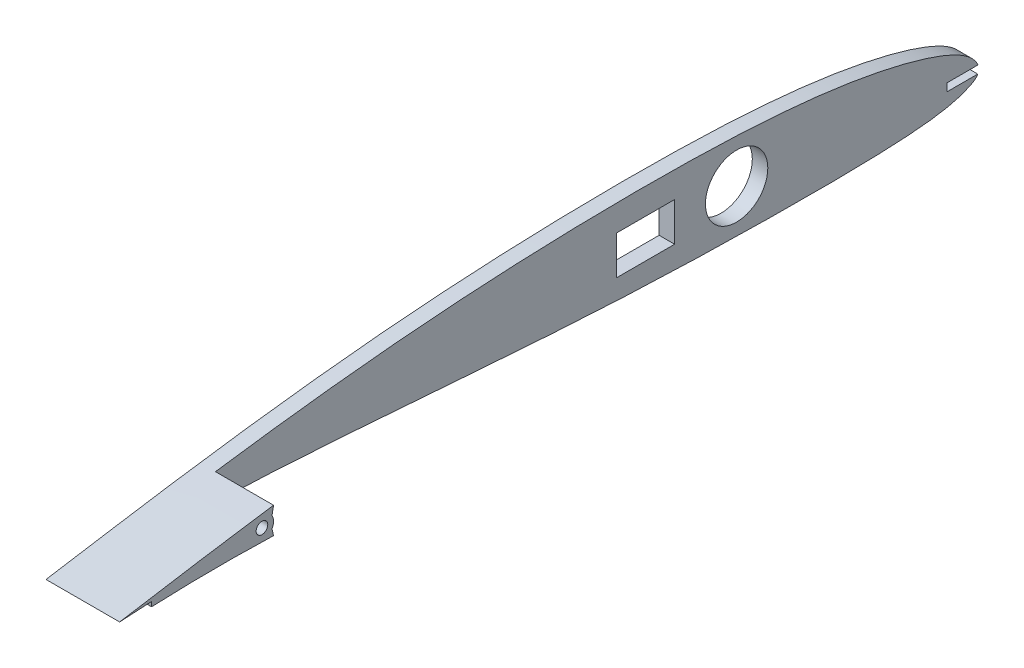
ISO-10303-21;
HEADER;
FILE_DESCRIPTION(('STEP AP214'),'2;1');
FILE_NAME('part.step','',(''),(''),'','','');
FILE_SCHEMA(('AUTOMOTIVE_DESIGN { 1 0 10303 214 1 1 1 1 }'));
ENDSEC;
DATA;
#1=APPLICATION_CONTEXT('core data for automotive mechanical design processes');
#2=APPLICATION_PROTOCOL_DEFINITION('international standard','automotive_design',2000,#1);
#3=PRODUCT_CONTEXT('',#1,'mechanical');
#4=PRODUCT('Part','Part','',(#3));
#5=PRODUCT_RELATED_PRODUCT_CATEGORY('part','',(#4));
#6=PRODUCT_DEFINITION_FORMATION('','',#4);
#7=PRODUCT_DEFINITION_CONTEXT('part definition',#1,'design');
#8=PRODUCT_DEFINITION('design','',#6,#7);
#9=PRODUCT_DEFINITION_SHAPE('','',#8);
#10=(LENGTH_UNIT() NAMED_UNIT(*) SI_UNIT(.MILLI.,.METRE.));
#11=(NAMED_UNIT(*) PLANE_ANGLE_UNIT() SI_UNIT($,.RADIAN.));
#12=(NAMED_UNIT(*) SI_UNIT($,.STERADIAN.) SOLID_ANGLE_UNIT());
#13=UNCERTAINTY_MEASURE_WITH_UNIT(LENGTH_MEASURE(1.E-05),#10,'distance_accuracy_value','');
#14=(GEOMETRIC_REPRESENTATION_CONTEXT(3) GLOBAL_UNCERTAINTY_ASSIGNED_CONTEXT((#13)) GLOBAL_UNIT_ASSIGNED_CONTEXT((#10,
#11,#12)) REPRESENTATION_CONTEXT('',''));
#15=CARTESIAN_POINT('',(0.,0.,0.));
#16=DIRECTION('',(0.,0.,1.));
#17=DIRECTION('',(1.,0.,0.));
#18=AXIS2_PLACEMENT_3D('',#15,#16,#17);
#19=CARTESIAN_POINT('',(4.,0.,250.));
#20=CARTESIAN_POINT('',(4.,-0.0080427959719715,250.000228293678));
#21=CARTESIAN_POINT('',(4.,0.172375657967406,248.284955515532));
#22=CARTESIAN_POINT('',(4.,0.308690014795419,246.518112419387));
#23=CARTESIAN_POINT('',(4.,0.685693593852336,242.189387343398));
#24=CARTESIAN_POINT('',(4.,1.07410152891603,236.806461263496));
#25=CARTESIAN_POINT('',(4.,1.49731723995003,229.680385951639));
#26=CARTESIAN_POINT('',(4.,1.8232186026768,221.18415869828));
#27=CARTESIAN_POINT('',(4.,1.96762610068065,211.337618207726));
#28=CARTESIAN_POINT('',(4.,1.83322105638369,200.371188527109));
#29=CARTESIAN_POINT('',(4.,1.38960528984164,188.499913622482));
#30=CARTESIAN_POINT('',(4.,0.706014078000893,175.953687417433));
#31=CARTESIAN_POINT('',(4.,-0.160208641561513,162.931424917666));
#32=CARTESIAN_POINT('',(4.,-1.14801632724376,149.615771743617));
#33=CARTESIAN_POINT('',(4.,-2.19092490983926,136.176354994724));
#34=CARTESIAN_POINT('',(4.,-3.21958397917046,122.767140548026));
#35=CARTESIAN_POINT('',(4.,-4.15274312671142,109.520053587455));
#36=CARTESIAN_POINT('',(4.,-4.93856436487493,96.5460959745437));
#37=CARTESIAN_POINT('',(4.,-5.53683070268675,83.9408193016427));
#38=CARTESIAN_POINT('',(4.,-5.94764820461108,71.8018392906514));
#39=CARTESIAN_POINT('',(4.,-6.21845093878312,60.2452560030716));
#40=CARTESIAN_POINT('',(4.,-6.35536975583973,49.3987328907547));
#41=CARTESIAN_POINT('',(4.,-6.38138796281789,39.3972261942655));
#42=CARTESIAN_POINT('',(4.,-6.26504923032313,30.3619348419668));
#43=CARTESIAN_POINT('',(4.,-6.01216491688521,22.4121811031587));
#44=CARTESIAN_POINT('',(4.,-5.59743390072595,15.6262272306516));
#45=CARTESIAN_POINT('',(4.,-4.92870657935606,10.0719075109048));
#46=CARTESIAN_POINT('',(4.,-4.04044698146404,5.69769261214423));
#47=CARTESIAN_POINT('',(4.,-2.8657529844069,2.62532063874475));
#48=CARTESIAN_POINT('',(4.,-1.7115284699546,0.494884225045661));
#49=CARTESIAN_POINT('',(4.,-0.410454230626488,-0.0213125491030087));
#50=CARTESIAN_POINT('',(4.,0.792659826704065,0.0311691995850224));
#51=CARTESIAN_POINT('',(4.,2.30568433693192,0.812599241892923));
#52=CARTESIAN_POINT('',(4.,4.23835242447377,2.72886351673443));
#53=CARTESIAN_POINT('',(4.,6.11817212106947,5.76990724125498));
#54=CARTESIAN_POINT('',(4.,7.91359420170391,9.88094280419771));
#55=CARTESIAN_POINT('',(4.,9.64131817838287,15.0749304677094));
#56=CARTESIAN_POINT('',(4.,11.2838964878058,21.2987522216172));
#57=CARTESIAN_POINT('',(4.,12.7883817585812,28.4971721202648));
#58=CARTESIAN_POINT('',(4.,14.0978349081275,36.6073734062479));
#59=CARTESIAN_POINT('',(4.,15.1594290171638,45.573028440303));
#60=CARTESIAN_POINT('',(4.,15.9609039979753,55.3329100744701));
#61=CARTESIAN_POINT('',(4.,16.4940697383882,65.8165364983871));
#62=CARTESIAN_POINT('',(4.,16.7919897051422,76.9313762604552));
#63=CARTESIAN_POINT('',(4.,16.864754130909,88.5669490281142));
#64=CARTESIAN_POINT('',(4.,16.7267152914356,100.596999885542));
#65=CARTESIAN_POINT('',(4.,16.3833850637257,112.888825982424));
#66=CARTESIAN_POINT('',(4.,15.825573666627,125.31161581915));
#67=CARTESIAN_POINT('',(4.,15.0523318700684,137.743791097076));
#68=CARTESIAN_POINT('',(4.,14.0593390742259,150.072384382085));
#69=CARTESIAN_POINT('',(4.,12.8815869860292,162.191375055682));
#70=CARTESIAN_POINT('',(4.,11.5492803460744,173.989074322246));
#71=CARTESIAN_POINT('',(4.,10.1162497290333,185.35236444642));
#72=CARTESIAN_POINT('',(4.,8.63237912523508,196.163081697706));
#73=CARTESIAN_POINT('',(4.,7.13151388385034,206.300441402258));
#74=CARTESIAN_POINT('',(4.,5.73122176805054,215.560350587015));
#75=CARTESIAN_POINT('',(4.,4.29329512716244,223.97715704258));
#76=CARTESIAN_POINT('',(4.,3.1818088737293,231.363413336396));
#77=CARTESIAN_POINT('',(4.,2.09894241729889,237.746440904332));
#78=CARTESIAN_POINT('',(4.,1.2458619166603,242.622069365861));
#79=CARTESIAN_POINT('',(4.,0.552864946230777,246.64452933247));
#80=CARTESIAN_POINT('',(4.,0.246216764640028,248.328398440367));
#81=CARTESIAN_POINT('',(4.,0.00797737724444139,249.999773563223));
#82=CARTESIAN_POINT('',(4.,0.,250.));
#83=B_SPLINE_CURVE_WITH_KNOTS('',3,(#19,#20,#21,#22,#23,#24,#25,#26,#27,#28,#29,#30,#31,#32,#33,
#34,#35,#36,#37,#38,#39,#40,#41,#42,#43,#44,#45,#46,#47,#48,#49,#50,#51,#52,#53,#54,#55,#56,#57,
#58,#59,#60,#61,#62,#63,#64,#65,#66,#67,#68,#69,#70,#71,#72,#73,#74,#75,#76,#77,#78,#79,#80,#81,
#82),.UNSPECIFIED.,.T.,.F.,(4,1,1,1,1,1,1,1,1,1,1,1,1,1,1,1,1,1,1,1,1,1,1,1,1,1,1,1,1,1,1,1,1,1,
1,1,1,1,1,1,1,1,1,1,1,1,1,1,1,1,1,1,1,1,1,1,1,1,1,1,1,4),(0.,0.00158888881614516,
0.00632921783555629,0.0142024564897436,0.0251728077530557,0.0391734833267743,0.0560606311759249,
0.0755789238487882,0.0973636066296903,0.120926258366677,0.145825281006277,0.171670911815127,
0.198108536705041,0.22479018357162,0.25139057978404,0.277643490654311,0.303326750051388,
0.328257458029316,0.352272548115194,0.375156061746876,0.396620664402003,0.416422729294005,
0.434304420097656,0.450054679859308,0.463465465082325,0.474478994238096,0.483169222153171,
0.489678354497499,0.494104066315722,0.496910015324886,0.497289784891853,0.501214273282496,
0.506457950332762,0.51335695674223,0.522168631834455,0.53296596992453,0.545689209241574,
0.56022077890382,0.57643892310517,0.594258689005965,0.613600244568652,0.634342385932902,
0.656331109263004,0.679351893859712,0.703152302846811,0.727478208080039,0.7520707394079,
0.776691163534608,0.801140183976245,0.825214386971546,0.848697423570622,0.871352857669295,
0.892947448931157,0.913230871058069,0.931955467148994,0.94834206907442,0.963693004275676,
0.976235918239566,0.986320058750392,0.993788799349345,0.998424034933867,1.),.UNSPECIFIED.);
#84=DIRECTION('',(-1.,0.,0.));
#85=VECTOR('',#84,1.);
#86=SURFACE_OF_LINEAR_EXTRUSION('',#83,#85);
#87=CARTESIAN_POINT('',(0.,0.,250.));
#88=CARTESIAN_POINT('',(0.,-0.0080427959719715,250.000228293678));
#89=CARTESIAN_POINT('',(0.,0.172375657967406,248.284955515532));
#90=CARTESIAN_POINT('',(0.,0.308690014795419,246.518112419387));
#91=CARTESIAN_POINT('',(0.,0.685693593852336,242.189387343398));
#92=CARTESIAN_POINT('',(0.,1.07410152891603,236.806461263496));
#93=CARTESIAN_POINT('',(0.,1.49731723995003,229.680385951639));
#94=CARTESIAN_POINT('',(0.,1.8232186026768,221.18415869828));
#95=CARTESIAN_POINT('',(0.,1.96762610068065,211.337618207726));
#96=CARTESIAN_POINT('',(0.,1.83322105638369,200.371188527109));
#97=CARTESIAN_POINT('',(0.,1.38960528984164,188.499913622482));
#98=CARTESIAN_POINT('',(0.,0.706014078000893,175.953687417433));
#99=CARTESIAN_POINT('',(0.,-0.160208641561513,162.931424917666));
#100=CARTESIAN_POINT('',(0.,-1.14801632724376,149.615771743617));
#101=CARTESIAN_POINT('',(0.,-2.19092490983926,136.176354994724));
#102=CARTESIAN_POINT('',(0.,-3.21958397917046,122.767140548026));
#103=CARTESIAN_POINT('',(0.,-4.15274312671142,109.520053587455));
#104=CARTESIAN_POINT('',(0.,-4.93856436487493,96.5460959745437));
#105=CARTESIAN_POINT('',(0.,-5.53683070268675,83.9408193016427));
#106=CARTESIAN_POINT('',(0.,-5.94764820461108,71.8018392906514));
#107=CARTESIAN_POINT('',(0.,-6.21845093878312,60.2452560030716));
#108=CARTESIAN_POINT('',(0.,-6.35536975583973,49.3987328907547));
#109=CARTESIAN_POINT('',(0.,-6.38138796281789,39.3972261942655));
#110=CARTESIAN_POINT('',(0.,-6.26504923032313,30.3619348419668));
#111=CARTESIAN_POINT('',(0.,-6.01216491688521,22.4121811031587));
#112=CARTESIAN_POINT('',(0.,-5.59743390072595,15.6262272306516));
#113=CARTESIAN_POINT('',(0.,-4.92870657935606,10.0719075109048));
#114=CARTESIAN_POINT('',(0.,-4.04044698146404,5.69769261214423));
#115=CARTESIAN_POINT('',(0.,-2.8657529844069,2.62532063874475));
#116=CARTESIAN_POINT('',(0.,-1.7115284699546,0.494884225045661));
#117=CARTESIAN_POINT('',(0.,-0.410454230626488,-0.0213125491030087));
#118=CARTESIAN_POINT('',(0.,0.792659826704065,0.0311691995850224));
#119=CARTESIAN_POINT('',(0.,2.30568433693192,0.812599241892923));
#120=CARTESIAN_POINT('',(0.,4.23835242447377,2.72886351673443));
#121=CARTESIAN_POINT('',(0.,6.11817212106947,5.76990724125498));
#122=CARTESIAN_POINT('',(0.,7.91359420170391,9.88094280419771));
#123=CARTESIAN_POINT('',(0.,9.64131817838287,15.0749304677094));
#124=CARTESIAN_POINT('',(0.,11.2838964878058,21.2987522216172));
#125=CARTESIAN_POINT('',(0.,12.7883817585812,28.4971721202648));
#126=CARTESIAN_POINT('',(0.,14.0978349081275,36.6073734062479));
#127=CARTESIAN_POINT('',(0.,15.1594290171638,45.573028440303));
#128=CARTESIAN_POINT('',(0.,15.9609039979753,55.3329100744701));
#129=CARTESIAN_POINT('',(0.,16.4940697383882,65.8165364983871));
#130=CARTESIAN_POINT('',(0.,16.7919897051422,76.9313762604552));
#131=CARTESIAN_POINT('',(0.,16.864754130909,88.5669490281142));
#132=CARTESIAN_POINT('',(0.,16.7267152914356,100.596999885542));
#133=CARTESIAN_POINT('',(0.,16.3833850637257,112.888825982424));
#134=CARTESIAN_POINT('',(0.,15.825573666627,125.31161581915));
#135=CARTESIAN_POINT('',(0.,15.0523318700684,137.743791097076));
#136=CARTESIAN_POINT('',(0.,14.0593390742259,150.072384382085));
#137=CARTESIAN_POINT('',(0.,12.8815869860292,162.191375055682));
#138=CARTESIAN_POINT('',(0.,11.5492803460744,173.989074322246));
#139=CARTESIAN_POINT('',(0.,10.1162497290333,185.35236444642));
#140=CARTESIAN_POINT('',(0.,8.63237912523508,196.163081697706));
#141=CARTESIAN_POINT('',(0.,7.13151388385034,206.300441402258));
#142=CARTESIAN_POINT('',(0.,5.73122176805054,215.560350587015));
#143=CARTESIAN_POINT('',(0.,4.29329512716244,223.97715704258));
#144=CARTESIAN_POINT('',(0.,3.1818088737293,231.363413336396));
#145=CARTESIAN_POINT('',(0.,2.09894241729889,237.746440904332));
#146=CARTESIAN_POINT('',(0.,1.2458619166603,242.622069365861));
#147=CARTESIAN_POINT('',(0.,0.552864946230777,246.64452933247));
#148=CARTESIAN_POINT('',(0.,0.246216764640028,248.328398440367));
#149=CARTESIAN_POINT('',(0.,0.00797737724443801,249.999773563223));
#150=CARTESIAN_POINT('',(0.,0.,250.));
#151=B_SPLINE_CURVE_WITH_KNOTS('',3,(#87,#88,#89,#90,#91,#92,#93,#94,#95,#96,#97,#98,#99,#100,
#101,#102,#103,#104,#105,#106,#107,#108,#109,#110,#111,#112,#113,#114,#115,#116,#117,#118,#119,
#120,#121,#122,#123,#124,#125,#126,#127,#128,#129,#130,#131,#132,#133,#134,#135,#136,#137,#138,
#139,#140,#141,#142,#143,#144,#145,#146,#147,#148,#149,#150),.UNSPECIFIED.,.T.,.F.,(4,1,1,1,1,1,
1,1,1,1,1,1,1,1,1,1,1,1,1,1,1,1,1,1,1,1,1,1,1,1,1,1,1,1,1,1,1,1,1,1,1,1,1,1,1,1,1,1,1,1,1,1,1,1,
1,1,1,1,1,1,1,4),(0.,0.00158888881614516,0.00632921783555629,0.0142024564897436,
0.0251728077530557,0.0391734833267743,0.0560606311759249,0.0755789238487882,0.0973636066296903,
0.120926258366677,0.145825281006277,0.171670911815127,0.198108536705041,0.22479018357162,
0.25139057978404,0.277643490654311,0.303326750051388,0.328257458029316,0.352272548115194,
0.375156061746876,0.396620664402003,0.416422729294005,0.434304420097656,0.450054679859308,
0.463465465082325,0.474478994238096,0.483169222153171,0.489678354497499,0.494104066315722,
0.496910015324886,0.497289784891853,0.501214273282496,0.506457950332762,0.51335695674223,
0.522168631834455,0.53296596992453,0.545689209241574,0.56022077890382,0.57643892310517,
0.594258689005965,0.613600244568652,0.634342385932902,0.656331109263004,0.679351893859712,
0.703152302846811,0.727478208080039,0.7520707394079,0.776691163534608,0.801140183976245,
0.825214386971546,0.848697423570622,0.871352857669295,0.892947448931157,0.913230871058069,
0.931955467148994,0.94834206907442,0.963693004275676,0.976235918239566,0.986320058750392,
0.993788799349345,0.998424034933867,1.),.UNSPECIFIED.);
#152=CARTESIAN_POINT('',(0.,0.999994806564996,0.201514661045604));
#153=VERTEX_POINT('',#152);
#154=CARTESIAN_POINT('',(0.,2.268144697166,236.731303851277));
#155=VERTEX_POINT('',#154);
#156=EDGE_CURVE('E162',#153,#155,#151,.T.);
#157=ORIENTED_EDGE('',*,*,#156,.T.);
#158=DIRECTION('',(-1.,0.,0.));
#159=VECTOR('',#158,1.);
#160=CARTESIAN_POINT('',(19.,2.268144697166,236.731303851277));
#161=LINE('',#160,#159);
#162=CARTESIAN_POINT('',(19.,2.268144697166,236.731303851277));
#163=VERTEX_POINT('',#162);
#164=EDGE_CURVE('E148',#163,#155,#161,.T.);
#165=ORIENTED_EDGE('',*,*,#164,.F.);
#166=CARTESIAN_POINT('',(19.,0.,250.));
#167=CARTESIAN_POINT('',(19.,-0.0080427959719715,250.000228293678));
#168=CARTESIAN_POINT('',(19.,0.172375657967406,248.284955515532));
#169=CARTESIAN_POINT('',(19.,0.308690014795419,246.518112419387));
#170=CARTESIAN_POINT('',(19.,0.685693593852336,242.189387343398));
#171=CARTESIAN_POINT('',(19.,1.07410152891603,236.806461263496));
#172=CARTESIAN_POINT('',(19.,1.49731723995003,229.680385951639));
#173=CARTESIAN_POINT('',(19.,1.8232186026768,221.18415869828));
#174=CARTESIAN_POINT('',(19.,1.96762610068065,211.337618207726));
#175=CARTESIAN_POINT('',(19.,1.83322105638369,200.371188527109));
#176=CARTESIAN_POINT('',(19.,1.38960528984164,188.499913622482));
#177=CARTESIAN_POINT('',(19.,0.706014078000893,175.953687417433));
#178=CARTESIAN_POINT('',(19.,-0.160208641561513,162.931424917666));
#179=CARTESIAN_POINT('',(19.,-1.14801632724376,149.615771743617));
#180=CARTESIAN_POINT('',(19.,-2.19092490983926,136.176354994724));
#181=CARTESIAN_POINT('',(19.,-3.21958397917046,122.767140548026));
#182=CARTESIAN_POINT('',(19.,-4.15274312671142,109.520053587455));
#183=CARTESIAN_POINT('',(19.,-4.93856436487493,96.5460959745437));
#184=CARTESIAN_POINT('',(19.,-5.53683070268675,83.9408193016427));
#185=CARTESIAN_POINT('',(19.,-5.94764820461108,71.8018392906514));
#186=CARTESIAN_POINT('',(19.,-6.21845093878312,60.2452560030716));
#187=CARTESIAN_POINT('',(19.,-6.35536975583973,49.3987328907547));
#188=CARTESIAN_POINT('',(19.,-6.38138796281789,39.3972261942655));
#189=CARTESIAN_POINT('',(19.,-6.26504923032313,30.3619348419668));
#190=CARTESIAN_POINT('',(19.,-6.01216491688521,22.4121811031587));
#191=CARTESIAN_POINT('',(19.,-5.59743390072595,15.6262272306516));
#192=CARTESIAN_POINT('',(19.,-4.92870657935606,10.0719075109048));
#193=CARTESIAN_POINT('',(19.,-4.04044698146404,5.69769261214423));
#194=CARTESIAN_POINT('',(19.,-2.8657529844069,2.62532063874475));
#195=CARTESIAN_POINT('',(19.,-1.7115284699546,0.494884225045661));
#196=CARTESIAN_POINT('',(19.,-0.410454230626488,-0.0213125491030087));
#197=CARTESIAN_POINT('',(19.,0.792659826704065,0.0311691995850224));
#198=CARTESIAN_POINT('',(19.,2.30568433693192,0.812599241892923));
#199=CARTESIAN_POINT('',(19.,4.23835242447377,2.72886351673443));
#200=CARTESIAN_POINT('',(19.,6.11817212106947,5.76990724125498));
#201=CARTESIAN_POINT('',(19.,7.91359420170391,9.88094280419771));
#202=CARTESIAN_POINT('',(19.,9.64131817838287,15.0749304677094));
#203=CARTESIAN_POINT('',(19.,11.2838964878058,21.2987522216172));
#204=CARTESIAN_POINT('',(19.,12.7883817585812,28.4971721202648));
#205=CARTESIAN_POINT('',(19.,14.0978349081275,36.6073734062479));
#206=CARTESIAN_POINT('',(19.,15.1594290171638,45.573028440303));
#207=CARTESIAN_POINT('',(19.,15.9609039979753,55.3329100744701));
#208=CARTESIAN_POINT('',(19.,16.4940697383882,65.8165364983871));
#209=CARTESIAN_POINT('',(19.,16.7919897051422,76.9313762604552));
#210=CARTESIAN_POINT('',(19.,16.864754130909,88.5669490281142));
#211=CARTESIAN_POINT('',(19.,16.7267152914356,100.596999885542));
#212=CARTESIAN_POINT('',(19.,16.3833850637257,112.888825982424));
#213=CARTESIAN_POINT('',(19.,15.825573666627,125.31161581915));
#214=CARTESIAN_POINT('',(19.,15.0523318700684,137.743791097076));
#215=CARTESIAN_POINT('',(19.,14.0593390742259,150.072384382085));
#216=CARTESIAN_POINT('',(19.,12.8815869860292,162.191375055682));
#217=CARTESIAN_POINT('',(19.,11.5492803460744,173.989074322246));
#218=CARTESIAN_POINT('',(19.,10.1162497290333,185.35236444642));
#219=CARTESIAN_POINT('',(19.,8.63237912523508,196.163081697706));
#220=CARTESIAN_POINT('',(19.,7.13151388385034,206.300441402258));
#221=CARTESIAN_POINT('',(19.,5.73122176805054,215.560350587015));
#222=CARTESIAN_POINT('',(19.,4.29329512716244,223.97715704258));
#223=CARTESIAN_POINT('',(19.,3.1818088737293,231.363413336396));
#224=CARTESIAN_POINT('',(19.,2.09894241729889,237.746440904332));
#225=CARTESIAN_POINT('',(19.,1.2458619166603,242.622069365861));
#226=CARTESIAN_POINT('',(19.,0.552864946230777,246.64452933247));
#227=CARTESIAN_POINT('',(19.,0.246216764640028,248.328398440367));
#228=CARTESIAN_POINT('',(19.,0.00797737724443801,249.999773563223));
#229=CARTESIAN_POINT('',(19.,0.,250.));
#230=B_SPLINE_CURVE_WITH_KNOTS('',3,(#166,#167,#168,#169,#170,#171,#172,#173,#174,#175,#176,
#177,#178,#179,#180,#181,#182,#183,#184,#185,#186,#187,#188,#189,#190,#191,#192,#193,#194,#195,
#196,#197,#198,#199,#200,#201,#202,#203,#204,#205,#206,#207,#208,#209,#210,#211,#212,#213,#214,
#215,#216,#217,#218,#219,#220,#221,#222,#223,#224,#225,#226,#227,#228,#229),.UNSPECIFIED.,.T.,
.F.,(4,1,1,1,1,1,1,1,1,1,1,1,1,1,1,1,1,1,1,1,1,1,1,1,1,1,1,1,1,1,1,1,1,1,1,1,1,1,1,1,1,1,1,1,1,
1,1,1,1,1,1,1,1,1,1,1,1,1,1,1,1,4),(0.,0.00158888881614516,0.00632921783555629,
0.0142024564897436,0.0251728077530557,0.0391734833267743,0.0560606311759249,0.0755789238487882,
0.0973636066296903,0.120926258366677,0.145825281006277,0.171670911815127,0.198108536705041,
0.22479018357162,0.25139057978404,0.277643490654311,0.303326750051388,0.328257458029316,
0.352272548115194,0.375156061746876,0.396620664402003,0.416422729294005,0.434304420097656,
0.450054679859308,0.463465465082325,0.474478994238096,0.483169222153171,0.489678354497499,
0.494104066315722,0.496910015324886,0.497289784891853,0.501214273282496,0.506457950332762,
0.51335695674223,0.522168631834455,0.53296596992453,0.545689209241574,0.56022077890382,
0.57643892310517,0.594258689005965,0.613600244568652,0.634342385932902,0.656331109263004,
0.679351893859712,0.703152302846811,0.727478208080039,0.7520707394079,0.776691163534608,
0.801140183976245,0.825214386971546,0.848697423570622,0.871352857669295,0.892947448931157,
0.913230871058069,0.931955467148994,0.94834206907442,0.963693004275676,0.976235918239566,
0.986320058750392,0.993788799349345,0.998424034933867,1.),.UNSPECIFIED.);
#231=CARTESIAN_POINT('',(19.,8.49375636792862,197.));
#232=VERTEX_POINT('',#231);
#233=EDGE_CURVE('E159',#232,#163,#230,.T.);
#234=ORIENTED_EDGE('',*,*,#233,.F.);
#235=DIRECTION('',(-1.,0.,0.));
#236=VECTOR('',#235,1.);
#237=CARTESIAN_POINT('',(38.3382300855436,8.49375636792862,197.));
#238=LINE('',#237,#236);
#239=CARTESIAN_POINT('',(4.,8.49375636792862,197.));
#240=VERTEX_POINT('',#239);
#241=EDGE_CURVE('E252',#232,#240,#238,.T.);
#242=ORIENTED_EDGE('',*,*,#241,.T.);
#243=CARTESIAN_POINT('',(4.,0.999994806564999,0.201514676074857));
#244=VERTEX_POINT('',#243);
#245=EDGE_CURVE('E188',#244,#240,#83,.T.);
#246=ORIENTED_EDGE('',*,*,#245,.F.);
#247=DIRECTION('',(-1.,0.,0.));
#248=VECTOR('',#247,1.);
#249=CARTESIAN_POINT('',(4.,0.999994806564999,0.201514676074857));
#250=LINE('',#249,#248);
#251=EDGE_CURVE('E11',#244,#153,#250,.T.);
#252=ORIENTED_EDGE('',*,*,#251,.T.);
#253=EDGE_LOOP('',(#157,#165,#234,#242,#246,#252));
#254=FACE_BOUND('',#253,.T.);
#255=ADVANCED_FACE('F32',(#254),#86,.F.);
#256=CARTESIAN_POINT('',(4.,1.49711132773622,0.435092083404368));
#257=DIRECTION('',(-1.,0.,0.));
#258=DIRECTION('',(0.,0.,1.));
#259=AXIS2_PLACEMENT_3D('',#256,#257,#258);
#260=PLANE('',#259);
#261=DIRECTION('',(0.,1.,0.));
#262=VECTOR('',#261,1.);
#263=CARTESIAN_POINT('',(4.,10.0773227037384,78.4999197093942));
#264=LINE('',#263,#262);
#265=CARTESIAN_POINT('',(4.,0.0773227037384437,78.4999197093942));
#266=VERTEX_POINT('',#265);
#267=CARTESIAN_POINT('',(4.,10.0773227037384,78.4999197093942));
#268=VERTEX_POINT('',#267);
#269=EDGE_CURVE('E220',#266,#268,#264,.T.);
#270=ORIENTED_EDGE('',*,*,#269,.F.);
#271=DIRECTION('',(0.,0.,-1.));
#272=VECTOR('',#271,1.);
#273=CARTESIAN_POINT('',(4.,0.0773227037384437,78.4999197093942));
#274=LINE('',#273,#272);
#275=CARTESIAN_POINT('',(4.,0.0773227037384437,93.4999197093942));
#276=VERTEX_POINT('',#275);
#277=EDGE_CURVE('E216',#276,#266,#274,.T.);
#278=ORIENTED_EDGE('',*,*,#277,.F.);
#279=DIRECTION('',(0.,-1.,0.));
#280=VECTOR('',#279,1.);
#281=CARTESIAN_POINT('',(4.,10.0773227037384,93.4999197093942));
#282=LINE('',#281,#280);
#283=CARTESIAN_POINT('',(4.,10.0773227037384,93.4999197093942));
#284=VERTEX_POINT('',#283);
#285=EDGE_CURVE('E232',#284,#276,#282,.T.);
#286=ORIENTED_EDGE('',*,*,#285,.F.);
#287=DIRECTION('',(0.,0.,1.));
#288=VECTOR('',#287,1.);
#289=CARTESIAN_POINT('',(4.,10.0773227037384,78.4999197093942));
#290=LINE('',#289,#288);
#291=EDGE_CURVE('E235',#268,#284,#290,.T.);
#292=ORIENTED_EDGE('',*,*,#291,.F.);
#293=EDGE_LOOP('',(#270,#278,#286,#292));
#294=FACE_BOUND('',#293,.T.);
#295=CARTESIAN_POINT('',(4.,5.07732270373844,62.4999197093942));
#296=DIRECTION('',(1.,0.,0.));
#297=DIRECTION('',(0.,0.,-1.));
#298=AXIS2_PLACEMENT_3D('',#295,#296,#297);
#299=CIRCLE('',#298,8.05);
#300=CARTESIAN_POINT('',(4.,5.07732270373844,54.4499197093942));
#301=VERTEX_POINT('',#300);
#302=EDGE_CURVE('E203',#301,#301,#299,.T.);
#303=ORIENTED_EDGE('',*,*,#302,.F.);
#304=EDGE_LOOP('',(#303));
#305=FACE_BOUND('',#304,.T.);
#306=DIRECTION('',(0.,1.,0.));
#307=VECTOR('',#306,1.);
#308=CARTESIAN_POINT('',(4.,1.49711132773622,8.19991970488098));
#309=LINE('',#308,#307);
#310=CARTESIAN_POINT('',(4.,-1.000005193435,8.19991970488098));
#311=VERTEX_POINT('',#310);
#312=CARTESIAN_POINT('',(4.,0.999994806564999,8.19991970488098));
#313=VERTEX_POINT('',#312);
#314=EDGE_CURVE('E254',#311,#313,#309,.T.);
#315=ORIENTED_EDGE('',*,*,#314,.T.);
#316=DIRECTION('',(0.,0.,-1.));
#317=VECTOR('',#316,1.);
#318=CARTESIAN_POINT('',(4.,0.999994806564996,0.435092083404369));
#319=LINE('',#318,#317);
#320=EDGE_CURVE('E267',#313,#244,#319,.T.);
#321=ORIENTED_EDGE('',*,*,#320,.T.);
#322=ORIENTED_EDGE('',*,*,#245,.T.);
#323=DIRECTION('',(0.,0.981774207848738,-0.190051058410583));
#324=VECTOR('',#323,1.);
#325=CARTESIAN_POINT('',(4.,8.49375636792862,197.));
#326=LINE('',#325,#324);
#327=CARTESIAN_POINT('',(4.,6.41748058964991,197.401923788647));
#328=VERTEX_POINT('',#327);
#329=EDGE_CURVE('E260',#328,#240,#326,.T.);
#330=ORIENTED_EDGE('',*,*,#329,.F.);
#331=CARTESIAN_POINT('',(4.,4.91748058964991,200.));
#332=DIRECTION('',(1.,0.,0.));
#333=DIRECTION('',(0.,0.,-1.));
#334=AXIS2_PLACEMENT_3D('',#331,#332,#333);
#335=CIRCLE('',#334,2.99999999999999);
#336=CARTESIAN_POINT('',(4.,3.41748058964991,197.401923788647));
#337=VERTEX_POINT('',#336);
#338=EDGE_CURVE('E172',#337,#328,#335,.T.);
#339=ORIENTED_EDGE('',*,*,#338,.F.);
#340=DIRECTION('',(0.,0.974013731573103,0.226488963764331));
#341=VECTOR('',#340,1.);
#342=CARTESIAN_POINT('',(4.,1.68901098706519,197.));
#343=LINE('',#342,#341);
#344=CARTESIAN_POINT('',(4.,1.68901098706519,197.));
#345=VERTEX_POINT('',#344);
#346=EDGE_CURVE('E255',#345,#337,#343,.T.);
#347=ORIENTED_EDGE('',*,*,#346,.F.);
#348=CARTESIAN_POINT('',(4.,-1.00000519343489,0.266537770752824));
#349=VERTEX_POINT('',#348);
#350=EDGE_CURVE('E184',#345,#349,#83,.T.);
#351=ORIENTED_EDGE('',*,*,#350,.T.);
#352=DIRECTION('',(0.,0.,1.));
#353=VECTOR('',#352,1.);
#354=CARTESIAN_POINT('',(4.,-1.000005193435,0.435092083404368));
#355=LINE('',#354,#353);
#356=EDGE_CURVE('E59',#349,#311,#355,.T.);
#357=ORIENTED_EDGE('',*,*,#356,.T.);
#358=EDGE_LOOP('',(#315,#321,#322,#330,#339,#347,#351,#357));
#359=FACE_BOUND('',#358,.T.);
#360=ADVANCED_FACE('F295',(#294,#305,#359),#260,.F.);
#361=CARTESIAN_POINT('',(4.,4.91748058964991,200.));
#362=DIRECTION('',(-1.,0.,0.));
#363=DIRECTION('',(0.,0.,-1.));
#364=AXIS2_PLACEMENT_3D('',#361,#362,#363);
#365=CIRCLE('',#364,1.5);
#366=CARTESIAN_POINT('',(4.,4.91748058964991,198.5));
#367=VERTEX_POINT('',#366);
#368=EDGE_CURVE('E238',#367,#367,#365,.T.);
#369=ORIENTED_EDGE('',*,*,#368,.F.);
#370=EDGE_LOOP('',(#369));
#371=FACE_BOUND('',#370,.T.);
#372=ADVANCED_FACE('F331',(#371),#260,.F.);
#373=CARTESIAN_POINT('',(0.,1.49711132773622,0.435092083404368));
#374=DIRECTION('',(-1.,0.,0.));
#375=DIRECTION('',(0.,0.,1.));
#376=AXIS2_PLACEMENT_3D('',#373,#374,#375);
#377=PLANE('',#376);
#378=DIRECTION('',(0.,-0.998451108391886,-0.0556361766390854));
#379=VECTOR('',#378,1.);
#380=CARTESIAN_POINT('',(0.,-12.6871870293484,227.685234986635));
#381=LINE('',#380,#379);
#382=CARTESIAN_POINT('',(0.,2.72436134676981,228.544004755659));
#383=VERTEX_POINT('',#382);
#384=CARTESIAN_POINT('',(0.,1.52622001582081,228.477241363067));
#385=VERTEX_POINT('',#384);
#386=EDGE_CURVE('E153',#383,#385,#381,.T.);
#387=ORIENTED_EDGE('',*,*,#386,.F.);
#388=DIRECTION('',(0.,0.0556361766390966,-0.998451108391885));
#389=VECTOR('',#388,1.);
#390=CARTESIAN_POINT('',(0.,15.4115483761208,0.858769769024383));
#391=LINE('',#390,#389);
#392=EDGE_CURVE('E288',#155,#383,#391,.T.);
#393=ORIENTED_EDGE('',*,*,#392,.F.);
#394=ORIENTED_EDGE('',*,*,#156,.F.);
#395=DIRECTION('',(0.,0.,-1.));
#396=VECTOR('',#395,1.);
#397=CARTESIAN_POINT('',(0.,0.999994806564996,-8.0295119016725E-05));
#398=LINE('',#397,#396);
#399=CARTESIAN_POINT('',(0.,0.999994806564999,8.19991970488098));
#400=VERTEX_POINT('',#399);
#401=EDGE_CURVE('E274',#400,#153,#398,.T.);
#402=ORIENTED_EDGE('',*,*,#401,.F.);
#403=DIRECTION('',(0.,1.,0.));
#404=VECTOR('',#403,1.);
#405=CARTESIAN_POINT('',(0.,-1.000005193435,8.19991970488098));
#406=LINE('',#405,#404);
#407=CARTESIAN_POINT('',(0.,-1.000005193435,8.19991970488098));
#408=VERTEX_POINT('',#407);
#409=EDGE_CURVE('E277',#408,#400,#406,.T.);
#410=ORIENTED_EDGE('',*,*,#409,.F.);
#411=DIRECTION('',(0.,0.,1.));
#412=VECTOR('',#411,1.);
#413=CARTESIAN_POINT('',(0.,-1.000005193435,-8.02951190163576E-05));
#414=LINE('',#413,#412);
#415=CARTESIAN_POINT('',(0.,-1.000005193435,0.266537777160357));
#416=VERTEX_POINT('',#415);
#417=EDGE_CURVE('E280',#416,#408,#414,.T.);
#418=ORIENTED_EDGE('',*,*,#417,.F.);
#419=EDGE_CURVE('E37',#385,#416,#151,.T.);
#420=ORIENTED_EDGE('',*,*,#419,.F.);
#421=EDGE_LOOP('',(#387,#393,#394,#402,#410,#418,#420));
#422=FACE_BOUND('',#421,.T.);
#423=CARTESIAN_POINT('',(0.,5.07732270373844,62.4999197093942));
#424=DIRECTION('',(1.,0.,0.));
#425=DIRECTION('',(0.,0.,-1.));
#426=AXIS2_PLACEMENT_3D('',#423,#424,#425);
#427=CIRCLE('',#426,8.05);
#428=CARTESIAN_POINT('',(0.,5.07732270373844,54.4499197093942));
#429=VERTEX_POINT('',#428);
#430=EDGE_CURVE('E197',#429,#429,#427,.T.);
#431=ORIENTED_EDGE('',*,*,#430,.T.);
#432=EDGE_LOOP('',(#431));
#433=FACE_BOUND('',#432,.T.);
#434=DIRECTION('',(0.,0.,-1.));
#435=VECTOR('',#434,1.);
#436=CARTESIAN_POINT('',(0.,0.0773227037384437,78.4999197093942));
#437=LINE('',#436,#435);
#438=CARTESIAN_POINT('',(0.,0.0773227037384437,93.4999197093942));
#439=VERTEX_POINT('',#438);
#440=CARTESIAN_POINT('',(0.,0.0773227037384437,78.4999197093942));
#441=VERTEX_POINT('',#440);
#442=EDGE_CURVE('E217',#439,#441,#437,.T.);
#443=ORIENTED_EDGE('',*,*,#442,.T.);
#444=DIRECTION('',(0.,1.,0.));
#445=VECTOR('',#444,1.);
#446=CARTESIAN_POINT('',(0.,10.0773227037384,78.4999197093942));
#447=LINE('',#446,#445);
#448=CARTESIAN_POINT('',(0.,10.0773227037384,78.4999197093942));
#449=VERTEX_POINT('',#448);
#450=EDGE_CURVE('E227',#441,#449,#447,.T.);
#451=ORIENTED_EDGE('',*,*,#450,.T.);
#452=DIRECTION('',(0.,0.,1.));
#453=VECTOR('',#452,1.);
#454=CARTESIAN_POINT('',(0.,10.0773227037384,78.4999197093942));
#455=LINE('',#454,#453);
#456=CARTESIAN_POINT('',(0.,10.0773227037384,93.4999197093942));
#457=VERTEX_POINT('',#456);
#458=EDGE_CURVE('E224',#449,#457,#455,.T.);
#459=ORIENTED_EDGE('',*,*,#458,.T.);
#460=DIRECTION('',(0.,-1.,0.));
#461=VECTOR('',#460,1.);
#462=CARTESIAN_POINT('',(0.,10.0773227037384,93.4999197093942));
#463=LINE('',#462,#461);
#464=EDGE_CURVE('E221',#457,#439,#463,.T.);
#465=ORIENTED_EDGE('',*,*,#464,.T.);
#466=EDGE_LOOP('',(#443,#451,#459,#465));
#467=FACE_BOUND('',#466,.T.);
#468=ADVANCED_FACE('F315',(#422,#433,#467),#377,.T.);
#469=CARTESIAN_POINT('',(19.,1.52622001582081,228.477241363067));
#470=VERTEX_POINT('',#469);
#471=CARTESIAN_POINT('',(19.,1.68901098706519,197.));
#472=VERTEX_POINT('',#471);
#473=EDGE_CURVE('E169',#470,#472,#230,.T.);
#474=ORIENTED_EDGE('',*,*,#473,.F.);
#475=DIRECTION('',(-1.,0.,0.));
#476=VECTOR('',#475,1.);
#477=CARTESIAN_POINT('',(19.,1.52622001582081,228.477241363067));
#478=LINE('',#477,#476);
#479=EDGE_CURVE('E282',#470,#385,#478,.T.);
#480=ORIENTED_EDGE('',*,*,#479,.T.);
#481=ORIENTED_EDGE('',*,*,#419,.T.);
#482=DIRECTION('',(-1.,0.,0.));
#483=VECTOR('',#482,1.);
#484=CARTESIAN_POINT('',(4.,-1.00000519343499,0.266537770752877));
#485=LINE('',#484,#483);
#486=EDGE_CURVE('E43',#416,#349,#485,.F.);
#487=ORIENTED_EDGE('',*,*,#486,.T.);
#488=ORIENTED_EDGE('',*,*,#350,.F.);
#489=DIRECTION('',(-1.,0.,0.));
#490=VECTOR('',#489,1.);
#491=CARTESIAN_POINT('',(38.3382300855436,1.68901098706519,197.));
#492=LINE('',#491,#490);
#493=EDGE_CURVE('E253',#472,#345,#492,.T.);
#494=ORIENTED_EDGE('',*,*,#493,.F.);
#495=EDGE_LOOP('',(#474,#480,#481,#487,#488,#494));
#496=FACE_BOUND('',#495,.T.);
#497=ADVANCED_FACE('F34',(#496),#86,.F.);
#498=CARTESIAN_POINT('',(4.,5.07732270373844,62.4999197093942));
#499=DIRECTION('',(-1.,0.,0.));
#500=DIRECTION('',(0.,0.,1.));
#501=AXIS2_PLACEMENT_3D('',#498,#499,#500);
#502=CYLINDRICAL_SURFACE('',#501,8.05);
#503=ORIENTED_EDGE('',*,*,#302,.T.);
#504=EDGE_LOOP('',(#503));
#505=FACE_BOUND('',#504,.T.);
#506=ORIENTED_EDGE('',*,*,#430,.F.);
#507=EDGE_LOOP('',(#506));
#508=FACE_BOUND('',#507,.T.);
#509=ADVANCED_FACE('F335',(#505,#508),#502,.F.);
#510=CARTESIAN_POINT('',(4.,10.0773227037384,78.4999197093942));
#511=DIRECTION('',(0.,0.,1.));
#512=DIRECTION('',(1.,0.,0.));
#513=AXIS2_PLACEMENT_3D('',#510,#511,#512);
#514=PLANE('',#513);
#515=ORIENTED_EDGE('',*,*,#450,.F.);
#516=DIRECTION('',(-1.,0.,0.));
#517=VECTOR('',#516,1.);
#518=CARTESIAN_POINT('',(4.,0.0773227037384437,78.4999197093942));
#519=LINE('',#518,#517);
#520=EDGE_CURVE('E213',#266,#441,#519,.T.);
#521=ORIENTED_EDGE('',*,*,#520,.F.);
#522=ORIENTED_EDGE('',*,*,#269,.T.);
#523=DIRECTION('',(-1.,0.,0.));
#524=VECTOR('',#523,1.);
#525=CARTESIAN_POINT('',(4.,10.0773227037384,78.4999197093942));
#526=LINE('',#525,#524);
#527=EDGE_CURVE('E204',#268,#449,#526,.T.);
#528=ORIENTED_EDGE('',*,*,#527,.T.);
#529=EDGE_LOOP('',(#515,#521,#522,#528));
#530=FACE_BOUND('',#529,.T.);
#531=ADVANCED_FACE('F340',(#530),#514,.T.);
#532=CARTESIAN_POINT('',(4.,10.0773227037384,78.4999197093942));
#533=DIRECTION('',(0.,-1.,0.));
#534=DIRECTION('',(0.,0.,-1.));
#535=AXIS2_PLACEMENT_3D('',#532,#533,#534);
#536=PLANE('',#535);
#537=ORIENTED_EDGE('',*,*,#458,.F.);
#538=ORIENTED_EDGE('',*,*,#527,.F.);
#539=ORIENTED_EDGE('',*,*,#291,.T.);
#540=DIRECTION('',(-1.,0.,0.));
#541=VECTOR('',#540,1.);
#542=CARTESIAN_POINT('',(4.,10.0773227037384,93.4999197093942));
#543=LINE('',#542,#541);
#544=EDGE_CURVE('E209',#284,#457,#543,.T.);
#545=ORIENTED_EDGE('',*,*,#544,.T.);
#546=EDGE_LOOP('',(#537,#538,#539,#545));
#547=FACE_BOUND('',#546,.T.);
#548=ADVANCED_FACE('F350',(#547),#536,.T.);
#549=CARTESIAN_POINT('',(4.,10.0773227037384,93.4999197093942));
#550=DIRECTION('',(0.,0.,-1.));
#551=DIRECTION('',(-1.,0.,0.));
#552=AXIS2_PLACEMENT_3D('',#549,#550,#551);
#553=PLANE('',#552);
#554=ORIENTED_EDGE('',*,*,#464,.F.);
#555=ORIENTED_EDGE('',*,*,#544,.F.);
#556=ORIENTED_EDGE('',*,*,#285,.T.);
#557=DIRECTION('',(-1.,0.,0.));
#558=VECTOR('',#557,1.);
#559=CARTESIAN_POINT('',(4.,0.0773227037384437,93.4999197093942));
#560=LINE('',#559,#558);
#561=EDGE_CURVE('E211',#276,#439,#560,.T.);
#562=ORIENTED_EDGE('',*,*,#561,.T.);
#563=EDGE_LOOP('',(#554,#555,#556,#562));
#564=FACE_BOUND('',#563,.T.);
#565=ADVANCED_FACE('F354',(#564),#553,.T.);
#566=CARTESIAN_POINT('',(4.,0.0773227037384437,78.4999197093942));
#567=DIRECTION('',(0.,1.,0.));
#568=DIRECTION('',(0.,0.,1.));
#569=AXIS2_PLACEMENT_3D('',#566,#567,#568);
#570=PLANE('',#569);
#571=ORIENTED_EDGE('',*,*,#442,.F.);
#572=ORIENTED_EDGE('',*,*,#561,.F.);
#573=ORIENTED_EDGE('',*,*,#277,.T.);
#574=ORIENTED_EDGE('',*,*,#520,.T.);
#575=EDGE_LOOP('',(#571,#572,#573,#574));
#576=FACE_BOUND('',#575,.T.);
#577=ADVANCED_FACE('F358',(#576),#570,.T.);
#578=CARTESIAN_POINT('',(19.,4.91748058964991,200.));
#579=DIRECTION('',(-1.,0.,0.));
#580=DIRECTION('',(0.,0.,1.));
#581=AXIS2_PLACEMENT_3D('',#578,#579,#580);
#582=CYLINDRICAL_SURFACE('',#581,1.5);
#583=ORIENTED_EDGE('',*,*,#368,.T.);
#584=EDGE_LOOP('',(#583));
#585=FACE_BOUND('',#584,.T.);
#586=CARTESIAN_POINT('',(19.,4.91748058964991,200.));
#587=DIRECTION('',(-1.,0.,0.));
#588=DIRECTION('',(0.,0.,-1.));
#589=AXIS2_PLACEMENT_3D('',#586,#587,#588);
#590=CIRCLE('',#589,1.5);
#591=CARTESIAN_POINT('',(19.,4.91748058964991,198.5));
#592=VERTEX_POINT('',#591);
#593=EDGE_CURVE('E230',#592,#592,#590,.T.);
#594=ORIENTED_EDGE('',*,*,#593,.F.);
#595=EDGE_LOOP('',(#594));
#596=FACE_BOUND('',#595,.T.);
#597=ADVANCED_FACE('F362',(#585,#596),#582,.F.);
#598=CARTESIAN_POINT('',(19.,4.91748058964991,200.));
#599=DIRECTION('',(1.,0.,0.));
#600=DIRECTION('',(0.,0.,-1.));
#601=AXIS2_PLACEMENT_3D('',#598,#599,#600);
#602=PLANE('',#601);
#603=DIRECTION('',(0.,-0.998451108391886,-0.0556361766390854));
#604=VECTOR('',#603,1.);
#605=CARTESIAN_POINT('',(19.,-12.6871870293484,227.685234986635));
#606=LINE('',#605,#604);
#607=CARTESIAN_POINT('',(19.,2.7243613467698,228.544004755659));
#608=VERTEX_POINT('',#607);
#609=EDGE_CURVE('E51',#608,#470,#606,.T.);
#610=ORIENTED_EDGE('',*,*,#609,.T.);
#611=ORIENTED_EDGE('',*,*,#473,.T.);
#612=DIRECTION('',(0.,0.974013731573103,0.226488963764331));
#613=VECTOR('',#612,1.);
#614=CARTESIAN_POINT('',(19.,1.68901098706519,197.));
#615=LINE('',#614,#613);
#616=CARTESIAN_POINT('',(19.,3.41748058964991,197.401923788647));
#617=VERTEX_POINT('',#616);
#618=EDGE_CURVE('E168',#472,#617,#615,.T.);
#619=ORIENTED_EDGE('',*,*,#618,.T.);
#620=CARTESIAN_POINT('',(19.,4.91748058964991,200.));
#621=DIRECTION('',(1.,0.,0.));
#622=DIRECTION('',(0.,0.,-1.));
#623=AXIS2_PLACEMENT_3D('',#620,#621,#622);
#624=CIRCLE('',#623,2.99999999999999);
#625=CARTESIAN_POINT('',(19.,6.41748058964991,197.401923788647));
#626=VERTEX_POINT('',#625);
#627=EDGE_CURVE('E248',#617,#626,#624,.T.);
#628=ORIENTED_EDGE('',*,*,#627,.T.);
#629=DIRECTION('',(0.,0.981774207848738,-0.190051058410583));
#630=VECTOR('',#629,1.);
#631=CARTESIAN_POINT('',(19.,8.49375636792862,197.));
#632=LINE('',#631,#630);
#633=EDGE_CURVE('E167',#626,#232,#632,.T.);
#634=ORIENTED_EDGE('',*,*,#633,.T.);
#635=ORIENTED_EDGE('',*,*,#233,.T.);
#636=DIRECTION('',(0.,0.0556361766390966,-0.998451108391885));
#637=VECTOR('',#636,1.);
#638=CARTESIAN_POINT('',(19.,15.4115483761208,0.858769769024383));
#639=LINE('',#638,#637);
#640=EDGE_CURVE('E144',#163,#608,#639,.T.);
#641=ORIENTED_EDGE('',*,*,#640,.T.);
#642=EDGE_LOOP('',(#610,#611,#619,#628,#634,#635,#641));
#643=FACE_BOUND('',#642,.T.);
#644=ORIENTED_EDGE('',*,*,#593,.T.);
#645=EDGE_LOOP('',(#644));
#646=FACE_BOUND('',#645,.T.);
#647=ADVANCED_FACE('F164',(#643,#646),#602,.T.);
#648=CARTESIAN_POINT('',(19.,4.91748058964991,200.));
#649=DIRECTION('',(-1.,0.,0.));
#650=DIRECTION('',(0.,0.,1.));
#651=AXIS2_PLACEMENT_3D('',#648,#649,#650);
#652=CYLINDRICAL_SURFACE('',#651,2.99999999999999);
#653=ORIENTED_EDGE('',*,*,#338,.T.);
#654=DIRECTION('',(-1.,0.,0.));
#655=VECTOR('',#654,1.);
#656=CARTESIAN_POINT('',(19.,6.41748058964991,197.401923788647));
#657=LINE('',#656,#655);
#658=EDGE_CURVE('E241',#626,#328,#657,.T.);
#659=ORIENTED_EDGE('',*,*,#658,.F.);
#660=ORIENTED_EDGE('',*,*,#627,.F.);
#661=DIRECTION('',(-1.,0.,0.));
#662=VECTOR('',#661,1.);
#663=CARTESIAN_POINT('',(19.,3.41748058964991,197.401923788647));
#664=LINE('',#663,#662);
#665=EDGE_CURVE('E245',#617,#337,#664,.T.);
#666=ORIENTED_EDGE('',*,*,#665,.T.);
#667=EDGE_LOOP('',(#653,#659,#660,#666));
#668=FACE_BOUND('',#667,.T.);
#669=ADVANCED_FACE('F300',(#668),#652,.T.);
#670=CARTESIAN_POINT('',(72.6764601710873,1.68901098706519,197.));
#671=DIRECTION('',(0.,-0.226488963764331,0.974013731573103));
#672=DIRECTION('',(0.,-0.974013731573103,-0.226488963764331));
#673=AXIS2_PLACEMENT_3D('',#670,#671,#672);
#674=PLANE('',#673);
#675=ORIENTED_EDGE('',*,*,#618,.F.);
#676=ORIENTED_EDGE('',*,*,#493,.T.);
#677=ORIENTED_EDGE('',*,*,#346,.T.);
#678=ORIENTED_EDGE('',*,*,#665,.F.);
#679=EDGE_LOOP('',(#675,#676,#677,#678));
#680=FACE_BOUND('',#679,.T.);
#681=ADVANCED_FACE('F301',(#680),#674,.F.);
#682=CARTESIAN_POINT('',(72.6764601710873,8.49375636792862,197.));
#683=DIRECTION('',(0.,0.190051058410583,0.981774207848738));
#684=DIRECTION('',(0.,-0.981774207848738,0.190051058410583));
#685=AXIS2_PLACEMENT_3D('',#682,#683,#684);
#686=PLANE('',#685);
#687=ORIENTED_EDGE('',*,*,#633,.F.);
#688=ORIENTED_EDGE('',*,*,#658,.T.);
#689=ORIENTED_EDGE('',*,*,#329,.T.);
#690=ORIENTED_EDGE('',*,*,#241,.F.);
#691=EDGE_LOOP('',(#687,#688,#689,#690));
#692=FACE_BOUND('',#691,.T.);
#693=ADVANCED_FACE('F303',(#692),#686,.F.);
#694=CARTESIAN_POINT('',(19.,-1.000005193435,8.19991970488098));
#695=DIRECTION('',(0.,0.,1.));
#696=DIRECTION('',(1.,0.,0.));
#697=AXIS2_PLACEMENT_3D('',#694,#695,#696);
#698=PLANE('',#697);
#699=DIRECTION('',(-1.,0.,0.));
#700=VECTOR('',#699,1.);
#701=CARTESIAN_POINT('',(19.,-1.000005193435,8.19991970488098));
#702=LINE('',#701,#700);
#703=EDGE_CURVE('E272',#311,#408,#702,.T.);
#704=ORIENTED_EDGE('',*,*,#703,.T.);
#705=ORIENTED_EDGE('',*,*,#409,.T.);
#706=DIRECTION('',(-1.,0.,0.));
#707=VECTOR('',#706,1.);
#708=CARTESIAN_POINT('',(19.,0.999994806564999,8.19991970488098));
#709=LINE('',#708,#707);
#710=EDGE_CURVE('E271',#313,#400,#709,.T.);
#711=ORIENTED_EDGE('',*,*,#710,.F.);
#712=ORIENTED_EDGE('',*,*,#314,.F.);
#713=EDGE_LOOP('',(#704,#705,#711,#712));
#714=FACE_BOUND('',#713,.T.);
#715=ADVANCED_FACE('F309',(#714),#698,.F.);
#716=CARTESIAN_POINT('',(19.,0.999994806564996,-8.0295119016725E-05));
#717=DIRECTION('',(0.,1.,0.));
#718=DIRECTION('',(0.,0.,1.));
#719=AXIS2_PLACEMENT_3D('',#716,#717,#718);
#720=PLANE('',#719);
#721=ORIENTED_EDGE('',*,*,#710,.T.);
#722=ORIENTED_EDGE('',*,*,#401,.T.);
#723=ORIENTED_EDGE('',*,*,#251,.F.);
#724=ORIENTED_EDGE('',*,*,#320,.F.);
#725=EDGE_LOOP('',(#721,#722,#723,#724));
#726=FACE_BOUND('',#725,.T.);
#727=ADVANCED_FACE('F307',(#726),#720,.F.);
#728=CARTESIAN_POINT('',(19.,-1.000005193435,-8.02951190163576E-05));
#729=DIRECTION('',(0.,-1.,0.));
#730=DIRECTION('',(0.,0.,-1.));
#731=AXIS2_PLACEMENT_3D('',#728,#729,#730);
#732=PLANE('',#731);
#733=ORIENTED_EDGE('',*,*,#486,.F.);
#734=ORIENTED_EDGE('',*,*,#417,.T.);
#735=ORIENTED_EDGE('',*,*,#703,.F.);
#736=ORIENTED_EDGE('',*,*,#356,.F.);
#737=EDGE_LOOP('',(#733,#734,#735,#736));
#738=FACE_BOUND('',#737,.T.);
#739=ADVANCED_FACE('F319',(#738),#732,.F.);
#740=CARTESIAN_POINT('',(19.,-12.6871870293484,227.685234986635));
#741=DIRECTION('',(0.,0.0556361766390854,-0.998451108391885));
#742=DIRECTION('',(0.,0.998451108391885,0.0556361766390854));
#743=AXIS2_PLACEMENT_3D('',#740,#741,#742);
#744=PLANE('',#743);
#745=ORIENTED_EDGE('',*,*,#386,.T.);
#746=ORIENTED_EDGE('',*,*,#479,.F.);
#747=ORIENTED_EDGE('',*,*,#609,.F.);
#748=DIRECTION('',(-1.,0.,0.));
#749=VECTOR('',#748,1.);
#750=CARTESIAN_POINT('',(19.,2.72436134676981,228.544004755659));
#751=LINE('',#750,#749);
#752=EDGE_CURVE('E150',#608,#383,#751,.T.);
#753=ORIENTED_EDGE('',*,*,#752,.T.);
#754=EDGE_LOOP('',(#745,#746,#747,#753));
#755=FACE_BOUND('',#754,.T.);
#756=ADVANCED_FACE('F317',(#755),#744,.F.);
#757=CARTESIAN_POINT('',(19.,15.4115483761208,0.858769769024383));
#758=DIRECTION('',(0.,0.998451108391885,0.0556361766390966));
#759=DIRECTION('',(0.,-0.0556361766390966,0.998451108391885));
#760=AXIS2_PLACEMENT_3D('',#757,#758,#759);
#761=PLANE('',#760);
#762=ORIENTED_EDGE('',*,*,#392,.T.);
#763=ORIENTED_EDGE('',*,*,#752,.F.);
#764=ORIENTED_EDGE('',*,*,#640,.F.);
#765=ORIENTED_EDGE('',*,*,#164,.T.);
#766=EDGE_LOOP('',(#762,#763,#764,#765));
#767=FACE_BOUND('',#766,.T.);
#768=ADVANCED_FACE('F147',(#767),#761,.F.);
#769=CLOSED_SHELL('',(#255,#360,#372,#468,#497,#509,#531,#548,#565,#577,#597,#647,#669,#681,
#693,#715,#727,#739,#756,#768));
#770=MANIFOLD_SOLID_BREP('B2',#769);
#771=ADVANCED_BREP_SHAPE_REPRESENTATION('',(#18,#770),#14);
#772=SHAPE_DEFINITION_REPRESENTATION(#9,#771);
ENDSEC;
END-ISO-10303-21;
